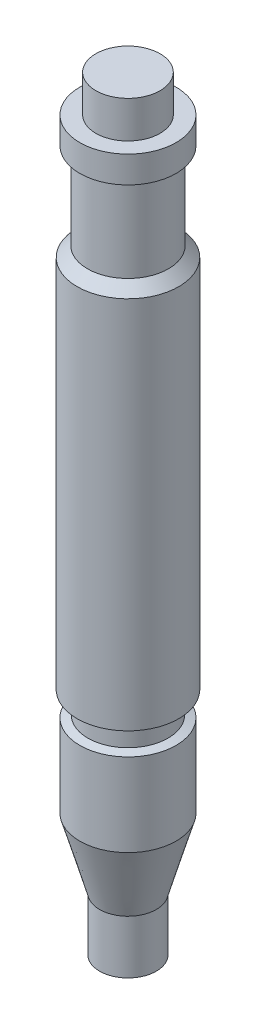
ISO-10303-21;
HEADER;
FILE_DESCRIPTION(('STEP AP214'),'2;1');
FILE_NAME('part.step','',(''),(''),'','','');
FILE_SCHEMA(('AUTOMOTIVE_DESIGN { 1 0 10303 214 1 1 1 1 }'));
ENDSEC;
DATA;
#1=APPLICATION_CONTEXT('core data for automotive mechanical design processes');
#2=APPLICATION_PROTOCOL_DEFINITION('international standard','automotive_design',2000,#1);
#3=PRODUCT_CONTEXT('',#1,'mechanical');
#4=PRODUCT('Part','Part','',(#3));
#5=PRODUCT_RELATED_PRODUCT_CATEGORY('part','',(#4));
#6=PRODUCT_DEFINITION_FORMATION('','',#4);
#7=PRODUCT_DEFINITION_CONTEXT('part definition',#1,'design');
#8=PRODUCT_DEFINITION('design','',#6,#7);
#9=PRODUCT_DEFINITION_SHAPE('','',#8);
#10=(LENGTH_UNIT() NAMED_UNIT(*) SI_UNIT(.MILLI.,.METRE.));
#11=(NAMED_UNIT(*) PLANE_ANGLE_UNIT() SI_UNIT($,.RADIAN.));
#12=(NAMED_UNIT(*) SI_UNIT($,.STERADIAN.) SOLID_ANGLE_UNIT());
#13=UNCERTAINTY_MEASURE_WITH_UNIT(LENGTH_MEASURE(1.E-05),#10,'distance_accuracy_value','');
#14=(GEOMETRIC_REPRESENTATION_CONTEXT(3) GLOBAL_UNCERTAINTY_ASSIGNED_CONTEXT((#13)) GLOBAL_UNIT_ASSIGNED_CONTEXT((#10,
#11,#12)) REPRESENTATION_CONTEXT('',''));
#15=CARTESIAN_POINT('',(0.,0.,0.));
#16=DIRECTION('',(0.,0.,1.));
#17=DIRECTION('',(1.,0.,0.));
#18=AXIS2_PLACEMENT_3D('',#15,#16,#17);
#19=CARTESIAN_POINT('',(0.,81.9238830131007,0.));
#20=DIRECTION('',(0.,-1.,0.));
#21=DIRECTION('',(0.,0.,-1.));
#22=AXIS2_PLACEMENT_3D('',#19,#20,#21);
#23=PLANE('',#22);
#24=CARTESIAN_POINT('',(0.,81.9238830131007,0.));
#25=DIRECTION('',(0.,1.,0.));
#26=DIRECTION('',(0.,0.,1.));
#27=AXIS2_PLACEMENT_3D('',#24,#25,#26);
#28=CIRCLE('',#27,5.99999999999999);
#29=CARTESIAN_POINT('',(0.,81.9238830131007,5.99999999999999));
#30=VERTEX_POINT('',#29);
#31=EDGE_CURVE('E10',#30,#30,#28,.T.);
#32=ORIENTED_EDGE('',*,*,#31,.T.);
#33=EDGE_LOOP('',(#32));
#34=FACE_BOUND('',#33,.T.);
#35=ADVANCED_FACE('F39',(#34),#23,.F.);
#36=CARTESIAN_POINT('',(0.,26.5392268814538,0.));
#37=DIRECTION('',(0.,1.,0.));
#38=DIRECTION('',(0.,0.,1.));
#39=AXIS2_PLACEMENT_3D('',#36,#37,#38);
#40=CYLINDRICAL_SURFACE('',#39,5.99999999999999);
#41=ORIENTED_EDGE('',*,*,#31,.F.);
#42=EDGE_LOOP('',(#41));
#43=FACE_BOUND('',#42,.T.);
#44=CARTESIAN_POINT('',(0.,75.0107599021235,0.));
#45=DIRECTION('',(0.,1.,0.));
#46=DIRECTION('',(0.,0.,1.));
#47=AXIS2_PLACEMENT_3D('',#44,#45,#46);
#48=CIRCLE('',#47,5.99999999999999);
#49=CARTESIAN_POINT('',(0.,75.0107599021235,5.99999999999999));
#50=VERTEX_POINT('',#49);
#51=EDGE_CURVE('E46',#50,#50,#48,.T.);
#52=ORIENTED_EDGE('',*,*,#51,.T.);
#53=EDGE_LOOP('',(#52));
#54=FACE_BOUND('',#53,.T.);
#55=ADVANCED_FACE('F123',(#43,#54),#40,.T.);
#56=CARTESIAN_POINT('',(5.99999999999999,75.0107599021235,0.));
#57=DIRECTION('',(0.,-1.,0.));
#58=DIRECTION('',(0.,0.,-1.));
#59=AXIS2_PLACEMENT_3D('',#56,#57,#58);
#60=PLANE('',#59);
#61=ORIENTED_EDGE('',*,*,#51,.F.);
#62=EDGE_LOOP('',(#61));
#63=FACE_BOUND('',#62,.T.);
#64=CARTESIAN_POINT('',(0.,75.0107599021235,0.));
#65=DIRECTION('',(0.,1.,0.));
#66=DIRECTION('',(0.,0.,1.));
#67=AXIS2_PLACEMENT_3D('',#64,#65,#66);
#68=CIRCLE('',#67,8.99999999999999);
#69=CARTESIAN_POINT('',(0.,75.0107599021235,8.99999999999999));
#70=VERTEX_POINT('',#69);
#71=EDGE_CURVE('E51',#70,#70,#68,.T.);
#72=ORIENTED_EDGE('',*,*,#71,.T.);
#73=EDGE_LOOP('',(#72));
#74=FACE_BOUND('',#73,.T.);
#75=ADVANCED_FACE('F127',(#63,#74),#60,.F.);
#76=CARTESIAN_POINT('',(0.,26.5392268814538,0.));
#77=DIRECTION('',(0.,1.,0.));
#78=DIRECTION('',(0.,0.,1.));
#79=AXIS2_PLACEMENT_3D('',#76,#77,#78);
#80=CYLINDRICAL_SURFACE('',#79,8.99999999999999);
#81=ORIENTED_EDGE('',*,*,#71,.F.);
#82=EDGE_LOOP('',(#81));
#83=FACE_BOUND('',#82,.T.);
#84=CARTESIAN_POINT('',(0.,70.0107599021235,0.));
#85=DIRECTION('',(0.,1.,0.));
#86=DIRECTION('',(0.,0.,1.));
#87=AXIS2_PLACEMENT_3D('',#84,#85,#86);
#88=CIRCLE('',#87,8.99999999999999);
#89=CARTESIAN_POINT('',(0.,70.0107599021235,8.99999999999999));
#90=VERTEX_POINT('',#89);
#91=EDGE_CURVE('E56',#90,#90,#88,.T.);
#92=ORIENTED_EDGE('',*,*,#91,.T.);
#93=EDGE_LOOP('',(#92));
#94=FACE_BOUND('',#93,.T.);
#95=ADVANCED_FACE('F132',(#83,#94),#80,.T.);
#96=CARTESIAN_POINT('',(8.99999999999999,70.0107599021235,0.));
#97=DIRECTION('',(0.,1.,0.));
#98=DIRECTION('',(0.,0.,1.));
#99=AXIS2_PLACEMENT_3D('',#96,#97,#98);
#100=PLANE('',#99);
#101=ORIENTED_EDGE('',*,*,#91,.F.);
#102=EDGE_LOOP('',(#101));
#103=FACE_BOUND('',#102,.T.);
#104=CARTESIAN_POINT('',(0.,70.0107599021235,0.));
#105=DIRECTION('',(0.,1.,0.));
#106=DIRECTION('',(0.,0.,1.));
#107=AXIS2_PLACEMENT_3D('',#104,#105,#106);
#108=CIRCLE('',#107,7.57339191989163);
#109=CARTESIAN_POINT('',(0.,70.0107599021235,7.57339191989163));
#110=VERTEX_POINT('',#109);
#111=EDGE_CURVE('E62',#110,#110,#108,.T.);
#112=ORIENTED_EDGE('',*,*,#111,.T.);
#113=EDGE_LOOP('',(#112));
#114=FACE_BOUND('',#113,.T.);
#115=ADVANCED_FACE('F138',(#103,#114),#100,.F.);
#116=CARTESIAN_POINT('',(0.,26.5392268814538,0.));
#117=DIRECTION('',(0.,1.,0.));
#118=DIRECTION('',(0.,0.,1.));
#119=AXIS2_PLACEMENT_3D('',#116,#117,#118);
#120=CYLINDRICAL_SURFACE('',#119,7.57339191989163);
#121=ORIENTED_EDGE('',*,*,#111,.F.);
#122=EDGE_LOOP('',(#121));
#123=FACE_BOUND('',#122,.T.);
#124=CARTESIAN_POINT('',(0.,53.8504910932091,0.));
#125=DIRECTION('',(0.,1.,0.));
#126=DIRECTION('',(0.,0.,1.));
#127=AXIS2_PLACEMENT_3D('',#124,#125,#126);
#128=CIRCLE('',#127,7.57339191989163);
#129=CARTESIAN_POINT('',(0.,53.8504910932091,7.57339191989163));
#130=VERTEX_POINT('',#129);
#131=EDGE_CURVE('E66',#130,#130,#128,.T.);
#132=ORIENTED_EDGE('',*,*,#131,.T.);
#133=EDGE_LOOP('',(#132));
#134=FACE_BOUND('',#133,.T.);
#135=ADVANCED_FACE('F142',(#123,#134),#120,.T.);
#136=CARTESIAN_POINT('',(0.,51.9238830131007,0.));
#137=DIRECTION('',(0.,-1.,0.));
#138=DIRECTION('',(0.,0.,-1.));
#139=AXIS2_PLACEMENT_3D('',#136,#137,#138);
#140=CONICAL_SURFACE('',#139,9.5,0.785398163397447);
#141=ORIENTED_EDGE('',*,*,#131,.F.);
#142=EDGE_LOOP('',(#141));
#143=FACE_BOUND('',#142,.T.);
#144=CARTESIAN_POINT('',(0.,51.9238830131007,0.));
#145=DIRECTION('',(0.,1.,0.));
#146=DIRECTION('',(0.,0.,1.));
#147=AXIS2_PLACEMENT_3D('',#144,#145,#146);
#148=CIRCLE('',#147,9.5);
#149=CARTESIAN_POINT('',(0.,51.9238830131007,9.5));
#150=VERTEX_POINT('',#149);
#151=EDGE_CURVE('E70',#150,#150,#148,.T.);
#152=ORIENTED_EDGE('',*,*,#151,.T.);
#153=EDGE_LOOP('',(#152));
#154=FACE_BOUND('',#153,.T.);
#155=ADVANCED_FACE('F146',(#143,#154),#140,.T.);
#156=CARTESIAN_POINT('',(0.,26.5392268814538,0.));
#157=DIRECTION('',(0.,1.,0.));
#158=DIRECTION('',(0.,0.,1.));
#159=AXIS2_PLACEMENT_3D('',#156,#157,#158);
#160=CYLINDRICAL_SURFACE('',#159,9.5);
#161=ORIENTED_EDGE('',*,*,#151,.F.);
#162=EDGE_LOOP('',(#161));
#163=FACE_BOUND('',#162,.T.);
#164=CARTESIAN_POINT('',(0.,-18.0761169868993,0.));
#165=DIRECTION('',(0.,1.,0.));
#166=DIRECTION('',(0.,0.,1.));
#167=AXIS2_PLACEMENT_3D('',#164,#165,#166);
#168=CIRCLE('',#167,9.5);
#169=CARTESIAN_POINT('',(0.,-18.0761169868993,9.5));
#170=VERTEX_POINT('',#169);
#171=EDGE_CURVE('E74',#170,#170,#168,.T.);
#172=ORIENTED_EDGE('',*,*,#171,.T.);
#173=EDGE_LOOP('',(#172));
#174=FACE_BOUND('',#173,.T.);
#175=ADVANCED_FACE('F150',(#163,#174),#160,.T.);
#176=CARTESIAN_POINT('',(9.5,-18.0761169868993,0.));
#177=DIRECTION('',(0.,1.,0.));
#178=DIRECTION('',(0.,0.,1.));
#179=AXIS2_PLACEMENT_3D('',#176,#177,#178);
#180=PLANE('',#179);
#181=CARTESIAN_POINT('',(0.,-18.0761169868993,0.));
#182=DIRECTION('',(0.,1.,0.));
#183=DIRECTION('',(0.,0.,1.));
#184=AXIS2_PLACEMENT_3D('',#181,#182,#183);
#185=CIRCLE('',#184,7.5);
#186=CARTESIAN_POINT('',(0.,-18.0761169868993,7.5));
#187=VERTEX_POINT('',#186);
#188=EDGE_CURVE('E78',#187,#187,#185,.T.);
#189=ORIENTED_EDGE('',*,*,#188,.T.);
#190=EDGE_LOOP('',(#189));
#191=FACE_BOUND('',#190,.T.);
#192=ORIENTED_EDGE('',*,*,#171,.F.);
#193=EDGE_LOOP('',(#192));
#194=FACE_BOUND('',#193,.T.);
#195=ADVANCED_FACE('F154',(#191,#194),#180,.F.);
#196=CARTESIAN_POINT('',(0.,-18.0761169868993,0.));
#197=DIRECTION('',(0.,1.,0.));
#198=DIRECTION('',(0.,0.,1.));
#199=AXIS2_PLACEMENT_3D('',#196,#197,#198);
#200=CYLINDRICAL_SURFACE('',#199,7.5);
#201=ORIENTED_EDGE('',*,*,#188,.F.);
#202=EDGE_LOOP('',(#201));
#203=FACE_BOUND('',#202,.T.);
#204=CARTESIAN_POINT('',(0.,-22.2200664309796,0.));
#205=DIRECTION('',(0.,1.,0.));
#206=DIRECTION('',(0.,0.,1.));
#207=AXIS2_PLACEMENT_3D('',#204,#205,#206);
#208=CIRCLE('',#207,7.5);
#209=CARTESIAN_POINT('',(0.,-22.2200664309796,7.5));
#210=VERTEX_POINT('',#209);
#211=EDGE_CURVE('E82',#210,#210,#208,.T.);
#212=ORIENTED_EDGE('',*,*,#211,.T.);
#213=EDGE_LOOP('',(#212));
#214=FACE_BOUND('',#213,.T.);
#215=ADVANCED_FACE('F158',(#203,#214),#200,.T.);
#216=CARTESIAN_POINT('',(0.,-22.6489981580093,0.));
#217=DIRECTION('',(0.,-1.,0.));
#218=DIRECTION('',(0.,0.,-1.));
#219=AXIS2_PLACEMENT_3D('',#216,#217,#218);
#220=CONICAL_SURFACE('',#219,9.,1.29227461113477);
#221=ORIENTED_EDGE('',*,*,#211,.F.);
#222=EDGE_LOOP('',(#221));
#223=FACE_BOUND('',#222,.T.);
#224=CARTESIAN_POINT('',(0.,-22.6489981580093,0.));
#225=DIRECTION('',(0.,1.,0.));
#226=DIRECTION('',(0.,0.,1.));
#227=AXIS2_PLACEMENT_3D('',#224,#225,#226);
#228=CIRCLE('',#227,9.);
#229=CARTESIAN_POINT('',(0.,-22.6489981580093,9.));
#230=VERTEX_POINT('',#229);
#231=EDGE_CURVE('E86',#230,#230,#228,.T.);
#232=ORIENTED_EDGE('',*,*,#231,.T.);
#233=EDGE_LOOP('',(#232));
#234=FACE_BOUND('',#233,.T.);
#235=ADVANCED_FACE('F162',(#223,#234),#220,.T.);
#236=CARTESIAN_POINT('',(0.,-18.0761169868993,0.));
#237=DIRECTION('',(0.,1.,0.));
#238=DIRECTION('',(0.,0.,1.));
#239=AXIS2_PLACEMENT_3D('',#236,#237,#238);
#240=CYLINDRICAL_SURFACE('',#239,9.);
#241=ORIENTED_EDGE('',*,*,#231,.F.);
#242=EDGE_LOOP('',(#241));
#243=FACE_BOUND('',#242,.T.);
#244=CARTESIAN_POINT('',(0.,-38.155089675449,0.));
#245=DIRECTION('',(0.,1.,0.));
#246=DIRECTION('',(0.,0.,1.));
#247=AXIS2_PLACEMENT_3D('',#244,#245,#246);
#248=CIRCLE('',#247,9.);
#249=CARTESIAN_POINT('',(0.,-38.155089675449,9.));
#250=VERTEX_POINT('',#249);
#251=EDGE_CURVE('E90',#250,#250,#248,.T.);
#252=ORIENTED_EDGE('',*,*,#251,.T.);
#253=EDGE_LOOP('',(#252));
#254=FACE_BOUND('',#253,.T.);
#255=ADVANCED_FACE('F166',(#243,#254),#240,.T.);
#256=CARTESIAN_POINT('',(0.,-51.0761169868993,0.));
#257=DIRECTION('',(0.,1.,0.));
#258=DIRECTION('',(0.,0.,1.));
#259=AXIS2_PLACEMENT_3D('',#256,#257,#258);
#260=CONICAL_SURFACE('',#259,5.3051742935341,0.278521715660128);
#261=ORIENTED_EDGE('',*,*,#251,.F.);
#262=EDGE_LOOP('',(#261));
#263=FACE_BOUND('',#262,.T.);
#264=CARTESIAN_POINT('',(0.,-51.0761169868993,0.));
#265=DIRECTION('',(0.,1.,0.));
#266=DIRECTION('',(0.,0.,1.));
#267=AXIS2_PLACEMENT_3D('',#264,#265,#266);
#268=CIRCLE('',#267,5.3051742935341);
#269=CARTESIAN_POINT('',(0.,-51.0761169868993,5.3051742935341));
#270=VERTEX_POINT('',#269);
#271=EDGE_CURVE('E94',#270,#270,#268,.T.);
#272=ORIENTED_EDGE('',*,*,#271,.T.);
#273=EDGE_LOOP('',(#272));
#274=FACE_BOUND('',#273,.T.);
#275=ADVANCED_FACE('F170',(#263,#274),#260,.T.);
#276=CARTESIAN_POINT('',(0.,-18.0761169868993,0.));
#277=DIRECTION('',(0.,1.,0.));
#278=DIRECTION('',(0.,0.,1.));
#279=AXIS2_PLACEMENT_3D('',#276,#277,#278);
#280=CYLINDRICAL_SURFACE('',#279,5.3051742935341);
#281=ORIENTED_EDGE('',*,*,#271,.F.);
#282=EDGE_LOOP('',(#281));
#283=FACE_BOUND('',#282,.T.);
#284=CARTESIAN_POINT('',(0.,-61.0761169868993,0.));
#285=DIRECTION('',(0.,1.,0.));
#286=DIRECTION('',(0.,0.,1.));
#287=AXIS2_PLACEMENT_3D('',#284,#285,#286);
#288=CIRCLE('',#287,5.3051742935341);
#289=CARTESIAN_POINT('',(0.,-61.0761169868993,5.3051742935341));
#290=VERTEX_POINT('',#289);
#291=EDGE_CURVE('E98',#290,#290,#288,.T.);
#292=ORIENTED_EDGE('',*,*,#291,.T.);
#293=EDGE_LOOP('',(#292));
#294=FACE_BOUND('',#293,.T.);
#295=ADVANCED_FACE('F174',(#283,#294),#280,.T.);
#296=CARTESIAN_POINT('',(5.3051742935341,-61.0761169868993,0.));
#297=DIRECTION('',(0.,1.,0.));
#298=DIRECTION('',(0.,0.,1.));
#299=AXIS2_PLACEMENT_3D('',#296,#297,#298);
#300=PLANE('',#299);
#301=ORIENTED_EDGE('',*,*,#291,.F.);
#302=EDGE_LOOP('',(#301));
#303=FACE_BOUND('',#302,.T.);
#304=CARTESIAN_POINT('',(0.,-61.0761169868993,0.));
#305=DIRECTION('',(0.,1.,0.));
#306=DIRECTION('',(0.,0.,1.));
#307=AXIS2_PLACEMENT_3D('',#304,#305,#306);
#308=CIRCLE('',#307,3.00000000000001);
#309=CARTESIAN_POINT('',(0.,-61.0761169868993,3.00000000000001));
#310=VERTEX_POINT('',#309);
#311=EDGE_CURVE('E102',#310,#310,#308,.T.);
#312=ORIENTED_EDGE('',*,*,#311,.T.);
#313=EDGE_LOOP('',(#312));
#314=FACE_BOUND('',#313,.T.);
#315=ADVANCED_FACE('F119',(#303,#314),#300,.F.);
#316=CARTESIAN_POINT('',(0.,-18.0761169868993,0.));
#317=DIRECTION('',(0.,1.,0.));
#318=DIRECTION('',(0.,0.,1.));
#319=AXIS2_PLACEMENT_3D('',#316,#317,#318);
#320=CYLINDRICAL_SURFACE('',#319,3.00000000000001);
#321=ORIENTED_EDGE('',*,*,#311,.F.);
#322=EDGE_LOOP('',(#321));
#323=FACE_BOUND('',#322,.T.);
#324=CARTESIAN_POINT('',(0.,-40.6707156883619,0.));
#325=DIRECTION('',(0.,1.,0.));
#326=DIRECTION('',(0.,0.,1.));
#327=AXIS2_PLACEMENT_3D('',#324,#325,#326);
#328=CIRCLE('',#327,3.00000000000001);
#329=CARTESIAN_POINT('',(0.,-40.6707156883619,3.00000000000001));
#330=VERTEX_POINT('',#329);
#331=EDGE_CURVE('E106',#330,#330,#328,.T.);
#332=ORIENTED_EDGE('',*,*,#331,.T.);
#333=EDGE_LOOP('',(#332));
#334=FACE_BOUND('',#333,.T.);
#335=ADVANCED_FACE('F111',(#323,#334),#320,.F.);
#336=CARTESIAN_POINT('',(3.00000000000001,-40.6707156883619,0.));
#337=DIRECTION('',(0.,1.,0.));
#338=DIRECTION('',(0.,0.,1.));
#339=AXIS2_PLACEMENT_3D('',#336,#337,#338);
#340=PLANE('',#339);
#341=ORIENTED_EDGE('',*,*,#331,.F.);
#342=EDGE_LOOP('',(#341));
#343=FACE_BOUND('',#342,.T.);
#344=ADVANCED_FACE('F113',(#343),#340,.F.);
#345=CLOSED_SHELL('',(#35,#55,#75,#95,#115,#135,#155,#175,#195,#215,#235,#255,#275,#295,#315,
#335,#344));
#346=MANIFOLD_SOLID_BREP('B2',#345);
#347=ADVANCED_BREP_SHAPE_REPRESENTATION('',(#18,#346),#14);
#348=SHAPE_DEFINITION_REPRESENTATION(#9,#347);
ENDSEC;
END-ISO-10303-21;
